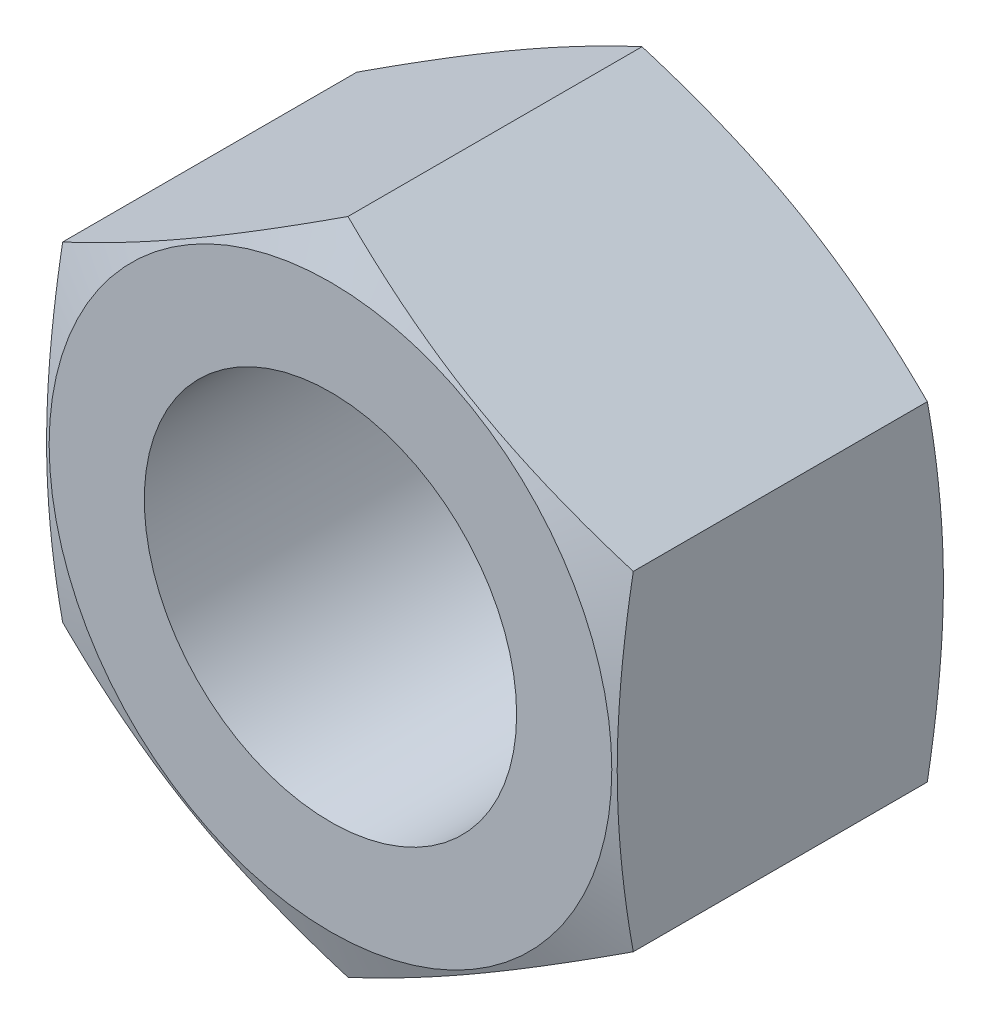
ISO-10303-21;
HEADER;
FILE_DESCRIPTION(('STEP AP214'),'2;1');
FILE_NAME('part.step','',(''),(''),'','','');
FILE_SCHEMA(('AUTOMOTIVE_DESIGN { 1 0 10303 214 1 1 1 1 }'));
ENDSEC;
DATA;
#1=APPLICATION_CONTEXT('core data for automotive mechanical design processes');
#2=APPLICATION_PROTOCOL_DEFINITION('international standard','automotive_design',2000,#1);
#3=PRODUCT_CONTEXT('',#1,'mechanical');
#4=PRODUCT('Part','Part','',(#3));
#5=PRODUCT_RELATED_PRODUCT_CATEGORY('part','',(#4));
#6=PRODUCT_DEFINITION_FORMATION('','',#4);
#7=PRODUCT_DEFINITION_CONTEXT('part definition',#1,'design');
#8=PRODUCT_DEFINITION('design','',#6,#7);
#9=PRODUCT_DEFINITION_SHAPE('','',#8);
#10=(LENGTH_UNIT() NAMED_UNIT(*) SI_UNIT(.MILLI.,.METRE.));
#11=(NAMED_UNIT(*) PLANE_ANGLE_UNIT() SI_UNIT($,.RADIAN.));
#12=(NAMED_UNIT(*) SI_UNIT($,.STERADIAN.) SOLID_ANGLE_UNIT());
#13=UNCERTAINTY_MEASURE_WITH_UNIT(LENGTH_MEASURE(1.E-05),#10,'distance_accuracy_value','');
#14=(GEOMETRIC_REPRESENTATION_CONTEXT(3) GLOBAL_UNCERTAINTY_ASSIGNED_CONTEXT((#13)) GLOBAL_UNIT_ASSIGNED_CONTEXT((#10,
#11,#12)) REPRESENTATION_CONTEXT('',''));
#15=CARTESIAN_POINT('',(0.,0.,0.));
#16=DIRECTION('',(0.,0.,1.));
#17=DIRECTION('',(1.,0.,0.));
#18=AXIS2_PLACEMENT_3D('',#15,#16,#17);
#19=CARTESIAN_POINT('',(0.,0.,-7.11630969809414E-11));
#20=DIRECTION('',(0.,0.,1.));
#21=DIRECTION('',(1.,0.,0.));
#22=AXIS2_PLACEMENT_3D('',#19,#20,#21);
#23=CONICAL_SURFACE('',#22,3.89000000089972,1.22173047603191);
#24=CARTESIAN_POINT('',(0.,0.,-7.11651489910011E-11));
#25=DIRECTION('',(0.,0.,-1.));
#26=DIRECTION('',(1.,0.,0.));
#27=AXIS2_PLACEMENT_3D('',#24,#25,#26);
#28=CIRCLE('',#27,3.89000000089972);
#29=CARTESIAN_POINT('',(3.89000000089972,0.,-7.11651489910011E-11));
#30=VERTEX_POINT('',#29);
#31=EDGE_CURVE('E57',#30,#30,#28,.T.);
#32=ORIENTED_EDGE('',*,*,#31,.F.);
#33=EDGE_LOOP('',(#32));
#34=FACE_BOUND('',#33,.T.);
#35=CARTESIAN_POINT('',(3.945,0.,0.0200183625086844));
#36=CARTESIAN_POINT('',(3.945,1.05705956416548,0.0200183625086844));
#37=CARTESIAN_POINT('',(3.945,2.27764681221525,0.242147075954829));
#38=B_SPLINE_CURVE_WITH_KNOTS('',2,(#35,#36,#37),.UNSPECIFIED.,.F.,.F.,(3,3),(0.,1.),.UNSPECIFIED.);
#39=CARTESIAN_POINT('',(3.945,0.,0.0200183625086844));
#40=VERTEX_POINT('',#39);
#41=CARTESIAN_POINT('',(3.94499999962717,2.27764681221525,0.242147075954829));
#42=VERTEX_POINT('',#41);
#43=EDGE_CURVE('E136',#40,#42,#38,.T.);
#44=ORIENTED_EDGE('',*,*,#43,.F.);
#45=CARTESIAN_POINT('',(3.945,-2.27764681221335,0.242147076072001));
#46=CARTESIAN_POINT('',(3.945,-1.05705956433113,0.0200183625086844));
#47=CARTESIAN_POINT('',(3.945,0.,0.0200183625086844));
#48=B_SPLINE_CURVE_WITH_KNOTS('',2,(#45,#46,#47),.UNSPECIFIED.,.F.,.F.,(3,3),(0.,1.),.UNSPECIFIED.);
#49=CARTESIAN_POINT('',(3.945,-2.27764681221335,0.242147076072001));
#50=VERTEX_POINT('',#49);
#51=EDGE_CURVE('E145',#50,#40,#48,.T.);
#52=ORIENTED_EDGE('',*,*,#51,.F.);
#53=CARTESIAN_POINT('',(-4.50854631406372E-11,-4.55529362402603,0.242147076039846));
#54=CARTESIAN_POINT('',(1.05680438937806,-3.94514732529923,0.0200719845481946));
#55=CARTESIAN_POINT('',(1.97249999992534,-3.41647021804311,0.0200183625305581));
#56=CARTESIAN_POINT('',(2.88768540331673,-2.88808767902578,0.0199647703900302));
#57=CARTESIAN_POINT('',(3.94499999990762,-2.27764681205334,0.242147076072001));
#58=B_SPLINE_CURVE_WITH_KNOTS('',2,(#53,#54,#55,#56,#57),.UNSPECIFIED.,.F.,.F.,(3,2,3),(0.,0.5,
1.),.UNSPECIFIED.);
#59=CARTESIAN_POINT('',(-9.01753487556029E-11,-4.55529362394794,0.242147076039846));
#60=VERTEX_POINT('',#59);
#61=EDGE_CURVE('E447',#60,#50,#58,.T.);
#62=ORIENTED_EDGE('',*,*,#61,.F.);
#63=CARTESIAN_POINT('',(-3.94500000001725,-2.27764681199004,0.2421470760368));
#64=CARTESIAN_POINT('',(-2.88819561074267,-2.88779311063106,0.0200719845395513));
#65=CARTESIAN_POINT('',(-1.97250000010394,-3.41647021793999,0.0200183625314603));
#66=CARTESIAN_POINT('',(-1.05731459689638,-3.94485275685118,0.0199647704004886));
#67=CARTESIAN_POINT('',(-9.01751661943511E-11,-4.55529362394794,0.242147076039846));
#68=B_SPLINE_CURVE_WITH_KNOTS('',2,(#63,#64,#65,#66,#67),.UNSPECIFIED.,.F.,.F.,(3,2,3),(0.,0.5,
1.),.UNSPECIFIED.);
#69=CARTESIAN_POINT('',(-3.94500000001725,-2.27764681199004,0.2421470760368));
#70=VERTEX_POINT('',#69);
#71=EDGE_CURVE('E435',#70,#60,#68,.T.);
#72=ORIENTED_EDGE('',*,*,#71,.F.);
#73=CARTESIAN_POINT('',(-3.945,0.,0.0200183625086803));
#74=CARTESIAN_POINT('',(-3.945,-1.05705956420375,0.0200183625086803));
#75=CARTESIAN_POINT('',(-3.945,-2.27764681199004,0.2421470760368));
#76=B_SPLINE_CURVE_WITH_KNOTS('',2,(#73,#74,#75),.UNSPECIFIED.,.F.,.F.,(3,3),(0.,1.),.UNSPECIFIED.);
#77=CARTESIAN_POINT('',(-3.945,0.,0.0200183625086843));
#78=VERTEX_POINT('',#77);
#79=EDGE_CURVE('E326',#78,#70,#76,.T.);
#80=ORIENTED_EDGE('',*,*,#79,.F.);
#81=CARTESIAN_POINT('',(-3.945,2.27764681185864,0.24214707600745));
#82=CARTESIAN_POINT('',(-3.945,1.057059564046,0.0200183625086803));
#83=CARTESIAN_POINT('',(-3.945,0.,0.0200183625086803));
#84=B_SPLINE_CURVE_WITH_KNOTS('',2,(#81,#82,#83),.UNSPECIFIED.,.F.,.F.,(3,3),(0.,1.),.UNSPECIFIED.);
#85=CARTESIAN_POINT('',(-3.945,2.27764681185864,0.242147076007449));
#86=VERTEX_POINT('',#85);
#87=EDGE_CURVE('E252',#86,#78,#84,.T.);
#88=ORIENTED_EDGE('',*,*,#87,.F.);
#89=CARTESIAN_POINT('',(-4.67151491101436E-10,4.55529362373029,0.242147076255129));
#90=CARTESIAN_POINT('',(-1.05680438912944,3.94514732544277,0.0200719844699548));
#91=CARTESIAN_POINT('',(-1.97250000035048,3.41647021779765,0.0200183625209252));
#92=CARTESIAN_POINT('',(-2.8876854035032,2.88808767891813,0.0199647704490193));
#93=CARTESIAN_POINT('',(-3.94500000006121,2.27764681196466,0.242147076007449));
#94=B_SPLINE_CURVE_WITH_KNOTS('',2,(#89,#90,#91,#92,#93),.UNSPECIFIED.,.F.,.F.,(3,2,3),(0.,0.5,
1.),.UNSPECIFIED.);
#95=CARTESIAN_POINT('',(-9.34306340397703E-10,4.55529362453942,0.242147076255128));
#96=VERTEX_POINT('',#95);
#97=EDGE_CURVE('E156',#96,#86,#94,.T.);
#98=ORIENTED_EDGE('',*,*,#97,.F.);
#99=CARTESIAN_POINT('',(3.94499999962717,2.27764681221525,0.242147075954829));
#100=CARTESIAN_POINT('',(2.8881956100088,2.88779311105477,0.0200719844512121));
#101=CARTESIAN_POINT('',(1.97249999928885,3.41647021841058,0.0200183625326596));
#102=CARTESIAN_POINT('',(1.05731459613108,3.94485275729302,0.0199647704911842));
#103=CARTESIAN_POINT('',(-9.34306461955934E-10,4.55529362453942,0.242147076255129));
#104=B_SPLINE_CURVE_WITH_KNOTS('',2,(#99,#100,#101,#102,#103),.UNSPECIFIED.,.F.,.F.,(3,2,3),(0.,
0.5,1.),.UNSPECIFIED.);
#105=EDGE_CURVE('E153',#42,#96,#104,.T.);
#106=ORIENTED_EDGE('',*,*,#105,.F.);
#107=EDGE_LOOP('',(#44,#52,#62,#72,#80,#88,#98,#106));
#108=FACE_BOUND('',#107,.T.);
#109=ADVANCED_FACE('F44',(#34,#108),#23,.T.);
#110=CARTESIAN_POINT('',(0.,0.,4.55000000034622));
#111=DIRECTION('',(0.,0.,-1.));
#112=DIRECTION('',(-1.,0.,0.));
#113=AXIS2_PLACEMENT_3D('',#110,#111,#112);
#114=CONICAL_SURFACE('',#113,3.89000000014401,1.22173047603191);
#115=CARTESIAN_POINT('',(0.,0.,4.55000000034622));
#116=DIRECTION('',(0.,0.,-1.));
#117=DIRECTION('',(-1.,0.,0.));
#118=AXIS2_PLACEMENT_3D('',#115,#116,#117);
#119=CIRCLE('',#118,3.89000000014401);
#120=CARTESIAN_POINT('',(3.89000000014401,0.,4.55000000034622));
#121=VERTEX_POINT('',#120);
#122=EDGE_CURVE('E11',#121,#121,#119,.T.);
#123=ORIENTED_EDGE('',*,*,#122,.T.);
#124=EDGE_LOOP('',(#123));
#125=FACE_BOUND('',#124,.T.);
#126=CARTESIAN_POINT('',(-3.945,0.,4.52998163749132));
#127=CARTESIAN_POINT('',(-3.945,1.05705956420801,4.52998163749132));
#128=CARTESIAN_POINT('',(-3.945,2.2776468119888,4.30785292396275));
#129=B_SPLINE_CURVE_WITH_KNOTS('',2,(#126,#127,#128),.UNSPECIFIED.,.F.,.F.,(3,3),(0.,1.),.UNSPECIFIED.);
#130=CARTESIAN_POINT('',(-3.945,0.,4.52998163749132));
#131=VERTEX_POINT('',#130);
#132=CARTESIAN_POINT('',(-3.9450000000194,2.2776468119888,4.30785292396275));
#133=VERTEX_POINT('',#132);
#134=EDGE_CURVE('E291',#131,#133,#129,.T.);
#135=ORIENTED_EDGE('',*,*,#134,.F.);
#136=CARTESIAN_POINT('',(-3.945,-2.27764681181472,4.30785292400054));
#137=CARTESIAN_POINT('',(-3.945,-1.0570595640107,4.52998163749132));
#138=CARTESIAN_POINT('',(-3.945,0.,4.52998163749132));
#139=B_SPLINE_CURVE_WITH_KNOTS('',2,(#136,#137,#138),.UNSPECIFIED.,.F.,.F.,(3,3),(0.,1.),.UNSPECIFIED.);
#140=CARTESIAN_POINT('',(-3.945,-2.27764681181472,4.30785292400054));
#141=VERTEX_POINT('',#140);
#142=EDGE_CURVE('E293',#141,#131,#139,.T.);
#143=ORIENTED_EDGE('',*,*,#142,.F.);
#144=CARTESIAN_POINT('',(-4.67152723589819E-10,-4.55529362373029,4.30785292374487));
#145=CARTESIAN_POINT('',(-1.05680438865123,-3.94514732571886,4.52992801548115));
#146=CARTESIAN_POINT('',(-1.97250000013846,-3.41647021792006,4.52998163746534));
#147=CARTESIAN_POINT('',(-2.8876854033584,-2.88808767900172,4.53003522957237));
#148=CARTESIAN_POINT('',(-3.94500000008023,-2.27764681195368,4.30785292400054));
#149=B_SPLINE_CURVE_WITH_KNOTS('',2,(#144,#145,#146,#147,#148),.UNSPECIFIED.,.F.,.F.,(3,2,3),
(0.,0.5,1.),.UNSPECIFIED.);
#150=CARTESIAN_POINT('',(-9.34306340397702E-10,-4.55529362453942,4.30785292374487));
#151=VERTEX_POINT('',#150);
#152=EDGE_CURVE('E299',#151,#141,#149,.T.);
#153=ORIENTED_EDGE('',*,*,#152,.F.);
#154=CARTESIAN_POINT('',(3.94500000029071,-2.27764681183216,4.30785292390573));
#155=CARTESIAN_POINT('',(2.88819561067555,-2.88779311066982,4.52992801538353));
#156=CARTESIAN_POINT('',(1.97250000016864,-3.41647021790263,4.52998163743721));
#157=CARTESIAN_POINT('',(1.05731459684921,-3.94485275687841,4.53003522961375));
#158=CARTESIAN_POINT('',(-9.34311655820252E-10,-4.55529362453943,4.30785292374487));
#159=B_SPLINE_CURVE_WITH_KNOTS('',2,(#154,#155,#156,#157,#158),.UNSPECIFIED.,.F.,.F.,(3,2,3),
(0.,0.5,1.),.UNSPECIFIED.);
#160=CARTESIAN_POINT('',(3.94500000029072,-2.27764681183216,4.30785292390573));
#161=VERTEX_POINT('',#160);
#162=EDGE_CURVE('E425',#161,#151,#159,.T.);
#163=ORIENTED_EDGE('',*,*,#162,.F.);
#164=CARTESIAN_POINT('',(3.945,0.,4.52998163749132));
#165=CARTESIAN_POINT('',(3.945,-1.05705956424174,4.52998163749132));
#166=CARTESIAN_POINT('',(3.945,-2.27764681183216,4.30785292390573));
#167=B_SPLINE_CURVE_WITH_KNOTS('',2,(#164,#165,#166),.UNSPECIFIED.,.F.,.F.,(3,3),(0.,1.),.UNSPECIFIED.);
#168=CARTESIAN_POINT('',(3.945,0.,4.52998163749132));
#169=VERTEX_POINT('',#168);
#170=EDGE_CURVE('E176',#169,#161,#167,.T.);
#171=ORIENTED_EDGE('',*,*,#170,.F.);
#172=CARTESIAN_POINT('',(3.945,2.277646812128,4.30785292394354));
#173=CARTESIAN_POINT('',(3.945,1.05705956564545,4.52998163749132));
#174=CARTESIAN_POINT('',(3.945,0.,4.52998163749132));
#175=B_SPLINE_CURVE_WITH_KNOTS('',2,(#172,#173,#174),.UNSPECIFIED.,.F.,.F.,(3,3),(0.,1.),.UNSPECIFIED.);
#176=CARTESIAN_POINT('',(3.945,2.277646812128,4.30785292394353));
#177=VERTEX_POINT('',#176);
#178=EDGE_CURVE('E171',#177,#169,#175,.T.);
#179=ORIENTED_EDGE('',*,*,#178,.F.);
#180=CARTESIAN_POINT('',(-4.50876400619509E-11,4.55529362402603,4.30785292396016));
#181=CARTESIAN_POINT('',(1.05680438933544,3.94514732532384,4.52992801544285));
#182=CARTESIAN_POINT('',(1.97249999985012,3.41647021808653,4.52998163746962));
#183=CARTESIAN_POINT('',(2.88768540314566,2.88808767912455,4.53003522961927));
#184=CARTESIAN_POINT('',(3.94499999994457,2.277646812032,4.30785292394354));
#185=B_SPLINE_CURVE_WITH_KNOTS('',2,(#180,#181,#182,#183,#184),.UNSPECIFIED.,.F.,.F.,(3,2,3),
(0.,0.5,1.),.UNSPECIFIED.);
#186=CARTESIAN_POINT('',(-9.01752413867419E-11,4.55529362394794,4.30785292396016));
#187=VERTEX_POINT('',#186);
#188=EDGE_CURVE('E163',#187,#177,#185,.T.);
#189=ORIENTED_EDGE('',*,*,#188,.F.);
#190=CARTESIAN_POINT('',(-3.94500000001941,2.2776468119888,4.30785292396275));
#191=CARTESIAN_POINT('',(-2.88819561074621,2.88779311062903,4.52992801546007));
#192=CARTESIAN_POINT('',(-1.97250000010559,3.41647021793904,4.52998163746846));
#193=CARTESIAN_POINT('',(-1.0573145968974,3.94485275685059,4.53003522959973));
#194=CARTESIAN_POINT('',(-9.01700589195364E-11,4.55529362394794,4.30785292396016));
#195=B_SPLINE_CURVE_WITH_KNOTS('',2,(#190,#191,#192,#193,#194),.UNSPECIFIED.,.F.,.F.,(3,2,3),
(0.,0.5,1.),.UNSPECIFIED.);
#196=EDGE_CURVE('E224',#133,#187,#195,.T.);
#197=ORIENTED_EDGE('',*,*,#196,.F.);
#198=EDGE_LOOP('',(#135,#143,#153,#163,#171,#179,#189,#197));
#199=FACE_BOUND('',#198,.T.);
#200=ADVANCED_FACE('F202',(#125,#199),#114,.T.);
#201=CARTESIAN_POINT('',(3.93668,-3.93668,0.));
#202=DIRECTION('',(0.,0.,-1.));
#203=DIRECTION('',(0.,-1.,0.));
#204=AXIS2_PLACEMENT_3D('',#201,#202,#203);
#205=PLANE('',#204);
#206=ORIENTED_EDGE('',*,*,#31,.T.);
#207=EDGE_LOOP('',(#206));
#208=FACE_BOUND('',#207,.T.);
#209=CARTESIAN_POINT('',(0.,0.,-7.11652958784725E-11));
#210=DIRECTION('',(0.,0.,1.));
#211=DIRECTION('',(1.,0.,0.));
#212=AXIS2_PLACEMENT_3D('',#209,#210,#211);
#213=CIRCLE('',#212,2.57419999999994);
#214=CARTESIAN_POINT('',(2.57419999999994,0.,-7.11652958784725E-11));
#215=VERTEX_POINT('',#214);
#216=EDGE_CURVE('E221',#215,#215,#213,.T.);
#217=ORIENTED_EDGE('',*,*,#216,.T.);
#218=EDGE_LOOP('',(#217));
#219=FACE_BOUND('',#218,.T.);
#220=ADVANCED_FACE('F205',(#208,#219),#205,.T.);
#221=CARTESIAN_POINT('',(3.93668,-3.93668,4.55));
#222=DIRECTION('',(0.,0.,-1.));
#223=DIRECTION('',(0.,-1.,0.));
#224=AXIS2_PLACEMENT_3D('',#221,#222,#223);
#225=PLANE('',#224);
#226=ORIENTED_EDGE('',*,*,#122,.F.);
#227=EDGE_LOOP('',(#226));
#228=FACE_BOUND('',#227,.T.);
#229=CARTESIAN_POINT('',(0.,0.,4.55));
#230=DIRECTION('',(0.,0.,1.));
#231=DIRECTION('',(1.,0.,0.));
#232=AXIS2_PLACEMENT_3D('',#229,#230,#231);
#233=CIRCLE('',#232,2.57419999999994);
#234=CARTESIAN_POINT('',(2.57419999999994,0.,4.55));
#235=VERTEX_POINT('',#234);
#236=EDGE_CURVE('E217',#235,#235,#233,.T.);
#237=ORIENTED_EDGE('',*,*,#236,.F.);
#238=EDGE_LOOP('',(#237));
#239=FACE_BOUND('',#238,.T.);
#240=ADVANCED_FACE('F46',(#228,#239),#225,.F.);
#241=CARTESIAN_POINT('',(0.,4.555293624,-0.057376191));
#242=DIRECTION('',(-0.500000000007727,-0.866025403779978,0.));
#243=DIRECTION('',(-0.866025403779978,0.500000000007727,0.));
#244=AXIS2_PLACEMENT_3D('',#241,#242,#243);
#245=PLANE('',#244);
#246=DIRECTION('',(0.,0.,1.));
#247=VECTOR('',#246,1.);
#248=CARTESIAN_POINT('',(3.945,2.277646812,2.275));
#249=LINE('',#248,#247);
#250=EDGE_CURVE('E143',#42,#177,#249,.T.);
#251=ORIENTED_EDGE('',*,*,#250,.F.);
#252=ORIENTED_EDGE('',*,*,#105,.T.);
#253=DIRECTION('',(0.,0.,-1.));
#254=VECTOR('',#253,1.);
#255=CARTESIAN_POINT('',(0.,4.555293624,2.275));
#256=LINE('',#255,#254);
#257=EDGE_CURVE('E183',#187,#96,#256,.T.);
#258=ORIENTED_EDGE('',*,*,#257,.F.);
#259=ORIENTED_EDGE('',*,*,#188,.T.);
#260=EDGE_LOOP('',(#251,#252,#258,#259));
#261=FACE_BOUND('',#260,.T.);
#262=ADVANCED_FACE('F167',(#261),#245,.F.);
#263=CARTESIAN_POINT('',(3.945,2.277646812,-0.007041417));
#264=DIRECTION('',(-1.,0.,0.));
#265=DIRECTION('',(0.,0.,1.));
#266=AXIS2_PLACEMENT_3D('',#263,#264,#265);
#267=PLANE('',#266);
#268=DIRECTION('',(0.,0.,1.));
#269=VECTOR('',#268,1.);
#270=CARTESIAN_POINT('',(3.945,-2.277646812,2.275));
#271=LINE('',#270,#269);
#272=EDGE_CURVE('E450',#50,#161,#271,.T.);
#273=ORIENTED_EDGE('',*,*,#272,.F.);
#274=ORIENTED_EDGE('',*,*,#51,.T.);
#275=ORIENTED_EDGE('',*,*,#43,.T.);
#276=ORIENTED_EDGE('',*,*,#250,.T.);
#277=ORIENTED_EDGE('',*,*,#178,.T.);
#278=ORIENTED_EDGE('',*,*,#170,.T.);
#279=EDGE_LOOP('',(#273,#274,#275,#276,#277,#278));
#280=FACE_BOUND('',#279,.T.);
#281=ADVANCED_FACE('F140',(#280),#267,.F.);
#282=CARTESIAN_POINT('',(3.945,-2.277646812,-0.057376191));
#283=DIRECTION('',(-0.500000000007727,0.866025403779978,0.));
#284=DIRECTION('',(0.,0.,1.));
#285=AXIS2_PLACEMENT_3D('',#282,#283,#284);
#286=PLANE('',#285);
#287=DIRECTION('',(0.,0.,1.));
#288=VECTOR('',#287,1.);
#289=CARTESIAN_POINT('',(0.,-4.555293624,2.275));
#290=LINE('',#289,#288);
#291=EDGE_CURVE('E445',#60,#151,#290,.T.);
#292=ORIENTED_EDGE('',*,*,#291,.F.);
#293=ORIENTED_EDGE('',*,*,#61,.T.);
#294=ORIENTED_EDGE('',*,*,#272,.T.);
#295=ORIENTED_EDGE('',*,*,#162,.T.);
#296=EDGE_LOOP('',(#292,#293,#294,#295));
#297=FACE_BOUND('',#296,.T.);
#298=ADVANCED_FACE('F387',(#297),#286,.F.);
#299=CARTESIAN_POINT('',(0.,-4.555293624,-0.057376191));
#300=DIRECTION('',(0.500000000007727,0.866025403779978,0.));
#301=DIRECTION('',(0.,0.,-1.));
#302=AXIS2_PLACEMENT_3D('',#299,#300,#301);
#303=PLANE('',#302);
#304=DIRECTION('',(0.,0.,1.));
#305=VECTOR('',#304,1.);
#306=CARTESIAN_POINT('',(-3.945,-2.277646812,2.275));
#307=LINE('',#306,#305);
#308=EDGE_CURVE('E186',#70,#141,#307,.T.);
#309=ORIENTED_EDGE('',*,*,#308,.F.);
#310=ORIENTED_EDGE('',*,*,#71,.T.);
#311=ORIENTED_EDGE('',*,*,#291,.T.);
#312=ORIENTED_EDGE('',*,*,#152,.T.);
#313=EDGE_LOOP('',(#309,#310,#311,#312));
#314=FACE_BOUND('',#313,.T.);
#315=ADVANCED_FACE('F267',(#314),#303,.F.);
#316=CARTESIAN_POINT('',(-3.945,-2.277646812,4.557041417));
#317=DIRECTION('',(1.,0.,0.));
#318=DIRECTION('',(0.,1.,0.));
#319=AXIS2_PLACEMENT_3D('',#316,#317,#318);
#320=PLANE('',#319);
#321=ORIENTED_EDGE('',*,*,#142,.T.);
#322=ORIENTED_EDGE('',*,*,#134,.T.);
#323=DIRECTION('',(0.,0.,1.));
#324=VECTOR('',#323,1.);
#325=CARTESIAN_POINT('',(-3.945,2.277646812,2.275));
#326=LINE('',#325,#324);
#327=EDGE_CURVE('E229',#86,#133,#326,.T.);
#328=ORIENTED_EDGE('',*,*,#327,.F.);
#329=ORIENTED_EDGE('',*,*,#87,.T.);
#330=ORIENTED_EDGE('',*,*,#79,.T.);
#331=ORIENTED_EDGE('',*,*,#308,.T.);
#332=EDGE_LOOP('',(#321,#322,#328,#329,#330,#331));
#333=FACE_BOUND('',#332,.T.);
#334=ADVANCED_FACE('F257',(#333),#320,.F.);
#335=CARTESIAN_POINT('',(-3.945,2.277646812,-0.057376191));
#336=DIRECTION('',(0.500000000007727,-0.866025403779978,0.));
#337=DIRECTION('',(0.,0.,-1.));
#338=AXIS2_PLACEMENT_3D('',#335,#336,#337);
#339=PLANE('',#338);
#340=ORIENTED_EDGE('',*,*,#257,.T.);
#341=ORIENTED_EDGE('',*,*,#97,.T.);
#342=ORIENTED_EDGE('',*,*,#327,.T.);
#343=ORIENTED_EDGE('',*,*,#196,.T.);
#344=EDGE_LOOP('',(#340,#341,#342,#343));
#345=FACE_BOUND('',#344,.T.);
#346=ADVANCED_FACE('F266',(#345),#339,.F.);
#347=CARTESIAN_POINT('',(0.,0.,-7.11652958784725E-11));
#348=DIRECTION('',(0.,0.,1.));
#349=DIRECTION('',(1.,0.,0.));
#350=AXIS2_PLACEMENT_3D('',#347,#348,#349);
#351=CYLINDRICAL_SURFACE('',#350,2.57419999999994);
#352=ORIENTED_EDGE('',*,*,#216,.F.);
#353=EDGE_LOOP('',(#352));
#354=FACE_BOUND('',#353,.T.);
#355=ORIENTED_EDGE('',*,*,#236,.T.);
#356=EDGE_LOOP('',(#355));
#357=FACE_BOUND('',#356,.T.);
#358=ADVANCED_FACE('F386',(#354,#357),#351,.F.);
#359=CLOSED_SHELL('',(#109,#200,#220,#240,#262,#281,#298,#315,#334,#346,#358));
#360=MANIFOLD_SOLID_BREP('B2',#359);
#361=ADVANCED_BREP_SHAPE_REPRESENTATION('',(#18,#360),#14);
#362=SHAPE_DEFINITION_REPRESENTATION(#9,#361);
ENDSEC;
END-ISO-10303-21;
